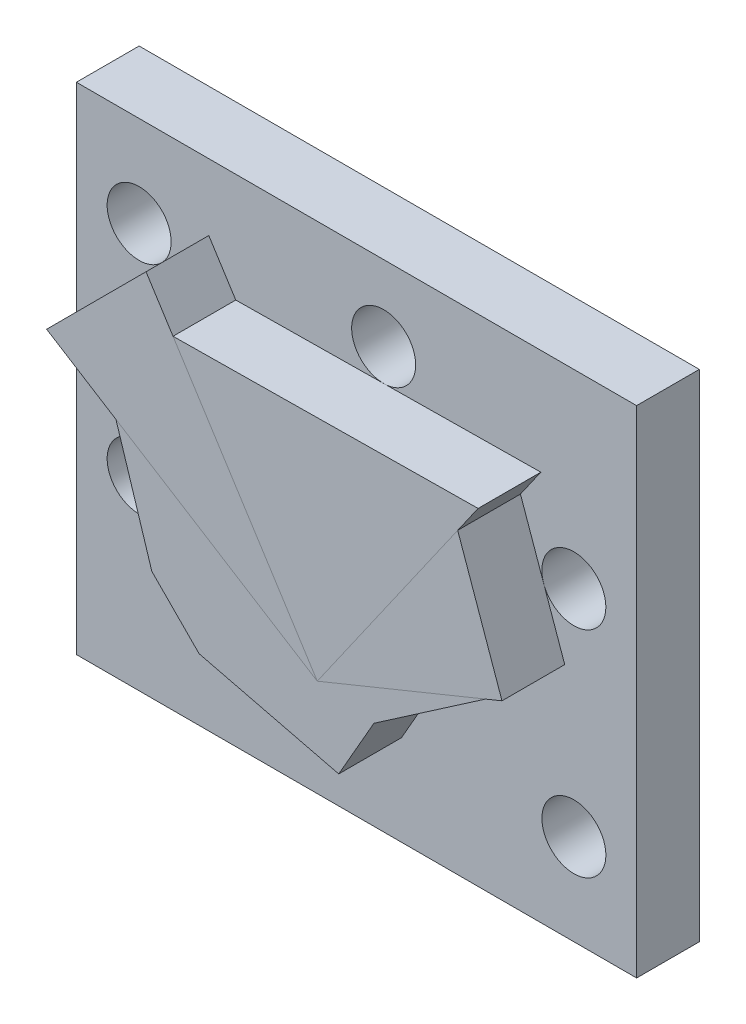
ISO-10303-21;
HEADER;
FILE_DESCRIPTION(('STEP AP214'),'2;1');
FILE_NAME('part.step','',(''),(''),'','','');
FILE_SCHEMA(('AUTOMOTIVE_DESIGN { 1 0 10303 214 1 1 1 1 }'));
ENDSEC;
DATA;
#1=APPLICATION_CONTEXT('core data for automotive mechanical design processes');
#2=APPLICATION_PROTOCOL_DEFINITION('international standard','automotive_design',2000,#1);
#3=PRODUCT_CONTEXT('',#1,'mechanical');
#4=PRODUCT('Part','Part','',(#3));
#5=PRODUCT_RELATED_PRODUCT_CATEGORY('part','',(#4));
#6=PRODUCT_DEFINITION_FORMATION('','',#4);
#7=PRODUCT_DEFINITION_CONTEXT('part definition',#1,'design');
#8=PRODUCT_DEFINITION('design','',#6,#7);
#9=PRODUCT_DEFINITION_SHAPE('','',#8);
#10=(LENGTH_UNIT() NAMED_UNIT(*) SI_UNIT(.MILLI.,.METRE.));
#11=(NAMED_UNIT(*) PLANE_ANGLE_UNIT() SI_UNIT($,.RADIAN.));
#12=(NAMED_UNIT(*) SI_UNIT($,.STERADIAN.) SOLID_ANGLE_UNIT());
#13=UNCERTAINTY_MEASURE_WITH_UNIT(LENGTH_MEASURE(1.E-05),#10,'distance_accuracy_value','');
#14=(GEOMETRIC_REPRESENTATION_CONTEXT(3) GLOBAL_UNCERTAINTY_ASSIGNED_CONTEXT((#13)) GLOBAL_UNIT_ASSIGNED_CONTEXT((#10,
#11,#12)) REPRESENTATION_CONTEXT('',''));
#15=CARTESIAN_POINT('',(0.,0.,0.));
#16=DIRECTION('',(0.,0.,1.));
#17=DIRECTION('',(1.,0.,0.));
#18=AXIS2_PLACEMENT_3D('',#15,#16,#17);
#19=CARTESIAN_POINT('',(14.4198396881023,-35.3574469152268,10.));
#20=DIRECTION('',(0.377632733495836,-0.925955462531791,0.));
#21=DIRECTION('',(0.925955462531791,0.377632733495836,0.));
#22=AXIS2_PLACEMENT_3D('',#19,#20,#21);
#23=PLANE('',#22);
#24=DIRECTION('',(-0.925955462531791,-0.377632733495836,0.));
#25=VECTOR('',#24,1.);
#26=CARTESIAN_POINT('',(14.4198396881023,-35.3574469152268,0.));
#27=LINE('',#26,#25);
#28=CARTESIAN_POINT('',(28.8574048943061,-29.4693697511959,0.));
#29=VERTEX_POINT('',#28);
#30=CARTESIAN_POINT('',(-0.582015344167753,-41.4756585923353,0.));
#31=VERTEX_POINT('',#30);
#32=EDGE_CURVE('E88',#29,#31,#27,.T.);
#33=ORIENTED_EDGE('',*,*,#32,.F.);
#34=DIRECTION('',(0.,0.,-1.));
#35=VECTOR('',#34,1.);
#36=CARTESIAN_POINT('',(28.8574048943061,-29.4693697511959,10.));
#37=LINE('',#36,#35);
#38=CARTESIAN_POINT('',(28.8574048943061,-29.4693697511959,10.));
#39=VERTEX_POINT('',#38);
#40=EDGE_CURVE('E12',#39,#29,#37,.T.);
#41=ORIENTED_EDGE('',*,*,#40,.F.);
#42=DIRECTION('',(-0.925955462531791,-0.377632733495836,0.));
#43=VECTOR('',#42,1.);
#44=CARTESIAN_POINT('',(14.4198396881023,-35.3574469152268,10.));
#45=LINE('',#44,#43);
#46=CARTESIAN_POINT('',(-0.582015344167753,-41.4756585923353,10.));
#47=VERTEX_POINT('',#46);
#48=EDGE_CURVE('E86',#39,#47,#45,.T.);
#49=ORIENTED_EDGE('',*,*,#48,.T.);
#50=DIRECTION('',(0.,0.,-1.));
#51=VECTOR('',#50,1.);
#52=CARTESIAN_POINT('',(-0.582015344167753,-41.4756585923353,10.));
#53=LINE('',#52,#51);
#54=EDGE_CURVE('E70',#47,#31,#53,.T.);
#55=ORIENTED_EDGE('',*,*,#54,.T.);
#56=EDGE_LOOP('',(#33,#41,#49,#55));
#57=FACE_BOUND('',#56,.T.);
#58=ADVANCED_FACE('F54',(#57),#23,.T.);
#59=CARTESIAN_POINT('',(16.4144567462538,5.79225285401134,10.));
#60=DIRECTION('',(0.943009891766731,0.332764697692074,0.));
#61=DIRECTION('',(-0.332764697692074,0.943009891766731,0.));
#62=AXIS2_PLACEMENT_3D('',#59,#60,#61);
#63=PLANE('',#62);
#64=DIRECTION('',(0.332764697692074,-0.943009891766731,0.));
#65=VECTOR('',#64,1.);
#66=CARTESIAN_POINT('',(16.4144567462538,5.79225285401134,0.));
#67=LINE('',#66,#65);
#68=CARTESIAN_POINT('',(21.7988449076238,-9.46637082962865,0.));
#69=VERTEX_POINT('',#68);
#70=EDGE_CURVE('E104',#69,#29,#67,.T.);
#71=ORIENTED_EDGE('',*,*,#70,.F.);
#72=DIRECTION('',(0.,0.,-1.));
#73=VECTOR('',#72,1.);
#74=CARTESIAN_POINT('',(21.7988449076238,-9.46637082962865,10.));
#75=LINE('',#74,#73);
#76=CARTESIAN_POINT('',(21.7988449076238,-9.46637082962865,10.));
#77=VERTEX_POINT('',#76);
#78=EDGE_CURVE('E62',#77,#69,#75,.T.);
#79=ORIENTED_EDGE('',*,*,#78,.F.);
#80=DIRECTION('',(0.332764697692074,-0.943009891766731,0.));
#81=VECTOR('',#80,1.);
#82=CARTESIAN_POINT('',(16.4144567462538,5.79225285401134,10.));
#83=LINE('',#82,#81);
#84=EDGE_CURVE('E95',#77,#39,#83,.T.);
#85=ORIENTED_EDGE('',*,*,#84,.T.);
#86=ORIENTED_EDGE('',*,*,#40,.T.);
#87=EDGE_LOOP('',(#71,#79,#85,#86));
#88=FACE_BOUND('',#87,.T.);
#89=ADVANCED_FACE('F99',(#88),#63,.T.);
#90=CARTESIAN_POINT('',(19.0866539535313,-13.345368318566,10.));
#91=DIRECTION('',(-0.819540223133238,0.573021659858267,0.));
#92=DIRECTION('',(-0.573021659858267,-0.819540223133238,0.));
#93=AXIS2_PLACEMENT_3D('',#90,#91,#92);
#94=PLANE('',#93);
#95=DIRECTION('',(0.573021659858267,0.819540223133238,0.));
#96=VECTOR('',#95,1.);
#97=CARTESIAN_POINT('',(19.0866539535313,-13.345368318566,0.));
#98=LINE('',#97,#96);
#99=EDGE_CURVE('E97',#31,#69,#98,.T.);
#100=ORIENTED_EDGE('',*,*,#99,.F.);
#101=ORIENTED_EDGE('',*,*,#54,.F.);
#102=DIRECTION('',(0.573021659858267,0.819540223133238,0.));
#103=VECTOR('',#102,1.);
#104=CARTESIAN_POINT('',(19.0866539535313,-13.345368318566,10.));
#105=LINE('',#104,#103);
#106=EDGE_CURVE('E96',#47,#77,#105,.T.);
#107=ORIENTED_EDGE('',*,*,#106,.T.);
#108=ORIENTED_EDGE('',*,*,#78,.T.);
#109=EDGE_LOOP('',(#100,#101,#107,#108));
#110=FACE_BOUND('',#109,.T.);
#111=ADVANCED_FACE('F110',(#110),#94,.T.);
#112=CARTESIAN_POINT('',(0.,0.,10.));
#113=DIRECTION('',(0.,0.,1.));
#114=DIRECTION('',(1.,0.,0.));
#115=AXIS2_PLACEMENT_3D('',#112,#113,#114);
#116=PLANE('',#115);
#117=ORIENTED_EDGE('',*,*,#48,.F.);
#118=ORIENTED_EDGE('',*,*,#84,.F.);
#119=ORIENTED_EDGE('',*,*,#106,.F.);
#120=EDGE_LOOP('',(#117,#118,#119));
#121=FACE_BOUND('',#120,.T.);
#122=ADVANCED_FACE('F94',(#121),#116,.T.);
#123=CARTESIAN_POINT('',(0.,0.,0.));
#124=DIRECTION('',(0.,0.,1.));
#125=DIRECTION('',(1.,0.,0.));
#126=AXIS2_PLACEMENT_3D('',#123,#124,#125);
#127=PLANE('',#126);
#128=ORIENTED_EDGE('',*,*,#32,.T.);
#129=ORIENTED_EDGE('',*,*,#99,.T.);
#130=ORIENTED_EDGE('',*,*,#70,.T.);
#131=EDGE_LOOP('',(#128,#129,#130));
#132=FACE_BOUND('',#131,.T.);
#133=ADVANCED_FACE('F109',(#132),#127,.F.);
#134=CLOSED_SHELL('',(#58,#89,#111,#122,#133));
#135=MANIFOLD_SOLID_BREP('B2',#134);
#136=CARTESIAN_POINT('',(19.0866539535313,-13.345368318566,10.));
#137=DIRECTION('',(-0.819540223133238,0.573021659858267,0.));
#138=DIRECTION('',(-0.573021659858267,-0.819540223133238,0.));
#139=AXIS2_PLACEMENT_3D('',#136,#137,#138);
#140=PLANE('',#139);
#141=DIRECTION('',(0.573021659858267,0.819540223133238,0.));
#142=VECTOR('',#141,1.);
#143=CARTESIAN_POINT('',(19.0866539535313,-13.345368318566,0.));
#144=LINE('',#143,#142);
#145=CARTESIAN_POINT('',(-0.582015344167753,-41.4756585923353,0.));
#146=VERTEX_POINT('',#145);
#147=CARTESIAN_POINT('',(25.0502953905899,-4.81611999098536,0.));
#148=VERTEX_POINT('',#147);
#149=EDGE_CURVE('E215',#146,#148,#144,.T.);
#150=ORIENTED_EDGE('',*,*,#149,.T.);
#151=DIRECTION('',(0.,0.,-1.));
#152=VECTOR('',#151,1.);
#153=CARTESIAN_POINT('',(25.0502953905899,-4.81611999098536,10.));
#154=LINE('',#153,#152);
#155=CARTESIAN_POINT('',(25.0502953905899,-4.81611999098536,10.));
#156=VERTEX_POINT('',#155);
#157=EDGE_CURVE('E52',#156,#148,#154,.T.);
#158=ORIENTED_EDGE('',*,*,#157,.F.);
#159=DIRECTION('',(0.573021659858267,0.819540223133238,0.));
#160=VECTOR('',#159,1.);
#161=CARTESIAN_POINT('',(19.0866539535313,-13.345368318566,10.));
#162=LINE('',#161,#160);
#163=CARTESIAN_POINT('',(-0.582015344167753,-41.4756585923353,10.));
#164=VERTEX_POINT('',#163);
#165=EDGE_CURVE('E208',#164,#156,#162,.T.);
#166=ORIENTED_EDGE('',*,*,#165,.F.);
#167=DIRECTION('',(0.,0.,-1.));
#168=VECTOR('',#167,1.);
#169=CARTESIAN_POINT('',(-0.582015344167753,-41.4756585923353,10.));
#170=LINE('',#169,#168);
#171=EDGE_CURVE('E216',#164,#146,#170,.T.);
#172=ORIENTED_EDGE('',*,*,#171,.T.);
#173=EDGE_LOOP('',(#150,#158,#166,#172));
#174=FACE_BOUND('',#173,.T.);
#175=ADVANCED_FACE('F168',(#174),#140,.F.);
#176=CARTESIAN_POINT('',(0.0578583485944003,-5.09967179448814,10.));
#177=DIRECTION('',(0.0113447742341961,-0.999935645978067,0.));
#178=DIRECTION('',(0.999935645978067,0.0113447742341961,0.));
#179=AXIS2_PLACEMENT_3D('',#176,#177,#178);
#180=PLANE('',#179);
#181=DIRECTION('',(-0.999935645978067,-0.0113447742341961,0.));
#182=VECTOR('',#181,1.);
#183=CARTESIAN_POINT('',(0.0578583485944003,-5.09967179448814,0.));
#184=LINE('',#183,#182);
#185=CARTESIAN_POINT('',(-23.5725859667269,-5.36777110356802,0.));
#186=VERTEX_POINT('',#185);
#187=EDGE_CURVE('E196',#148,#186,#184,.T.);
#188=ORIENTED_EDGE('',*,*,#187,.T.);
#189=DIRECTION('',(0.,0.,-1.));
#190=VECTOR('',#189,1.);
#191=CARTESIAN_POINT('',(-23.5725859667269,-5.36777110356802,10.));
#192=LINE('',#191,#190);
#193=CARTESIAN_POINT('',(-23.5725859667269,-5.36777110356802,10.));
#194=VERTEX_POINT('',#193);
#195=EDGE_CURVE('E176',#194,#186,#192,.T.);
#196=ORIENTED_EDGE('',*,*,#195,.F.);
#197=DIRECTION('',(-0.999935645978067,-0.0113447742341961,0.));
#198=VECTOR('',#197,1.);
#199=CARTESIAN_POINT('',(0.0578583485944003,-5.09967179448814,10.));
#200=LINE('',#199,#198);
#201=EDGE_CURVE('E204',#156,#194,#200,.T.);
#202=ORIENTED_EDGE('',*,*,#201,.F.);
#203=ORIENTED_EDGE('',*,*,#157,.T.);
#204=EDGE_LOOP('',(#188,#196,#202,#203));
#205=FACE_BOUND('',#204,.T.);
#206=ADVANCED_FACE('F205',(#205),#180,.F.);
#207=CARTESIAN_POINT('',(-19.2045957316195,-12.2279270583982,10.));
#208=DIRECTION('',(0.843525766080245,0.537088709580397,0.));
#209=DIRECTION('',(-0.537088709580397,0.843525766080245,0.));
#210=AXIS2_PLACEMENT_3D('',#207,#208,#209);
#211=PLANE('',#210);
#212=DIRECTION('',(0.537088709580397,-0.843525766080245,0.));
#213=VECTOR('',#212,1.);
#214=CARTESIAN_POINT('',(-19.2045957316195,-12.2279270583982,0.));
#215=LINE('',#214,#213);
#216=EDGE_CURVE('E201',#186,#146,#215,.T.);
#217=ORIENTED_EDGE('',*,*,#216,.T.);
#218=ORIENTED_EDGE('',*,*,#171,.F.);
#219=DIRECTION('',(0.537088709580397,-0.843525766080245,0.));
#220=VECTOR('',#219,1.);
#221=CARTESIAN_POINT('',(-19.2045957316195,-12.2279270583982,10.));
#222=LINE('',#221,#220);
#223=EDGE_CURVE('E184',#194,#164,#222,.T.);
#224=ORIENTED_EDGE('',*,*,#223,.F.);
#225=ORIENTED_EDGE('',*,*,#195,.T.);
#226=EDGE_LOOP('',(#217,#218,#224,#225));
#227=FACE_BOUND('',#226,.T.);
#228=ADVANCED_FACE('F223',(#227),#211,.F.);
#229=CARTESIAN_POINT('',(0.,0.,10.));
#230=DIRECTION('',(0.,0.,1.));
#231=DIRECTION('',(1.,0.,0.));
#232=AXIS2_PLACEMENT_3D('',#229,#230,#231);
#233=PLANE('',#232);
#234=ORIENTED_EDGE('',*,*,#165,.T.);
#235=ORIENTED_EDGE('',*,*,#201,.T.);
#236=ORIENTED_EDGE('',*,*,#223,.T.);
#237=EDGE_LOOP('',(#234,#235,#236));
#238=FACE_BOUND('',#237,.T.);
#239=ADVANCED_FACE('F211',(#238),#233,.T.);
#240=CARTESIAN_POINT('',(0.,0.,0.));
#241=DIRECTION('',(0.,0.,1.));
#242=DIRECTION('',(1.,0.,0.));
#243=AXIS2_PLACEMENT_3D('',#240,#241,#242);
#244=PLANE('',#243);
#245=ORIENTED_EDGE('',*,*,#149,.F.);
#246=ORIENTED_EDGE('',*,*,#216,.F.);
#247=ORIENTED_EDGE('',*,*,#187,.F.);
#248=EDGE_LOOP('',(#245,#246,#247));
#249=FACE_BOUND('',#248,.T.);
#250=ADVANCED_FACE('F224',(#249),#244,.F.);
#251=CLOSED_SHELL('',(#175,#206,#228,#239,#250));
#252=MANIFOLD_SOLID_BREP('B6',#251);
#253=CARTESIAN_POINT('',(-19.2045957316195,-12.2279270583982,10.));
#254=DIRECTION('',(0.843525766080245,0.537088709580397,0.));
#255=DIRECTION('',(-0.537088709580397,0.843525766080245,0.));
#256=AXIS2_PLACEMENT_3D('',#253,#254,#255);
#257=PLANE('',#256);
#258=DIRECTION('',(0.537088709580397,-0.843525766080245,0.));
#259=VECTOR('',#258,1.);
#260=CARTESIAN_POINT('',(-19.2045957316195,-12.2279270583982,0.));
#261=LINE('',#260,#259);
#262=CARTESIAN_POINT('',(-27.8734365088075,1.38693846971547,0.));
#263=VERTEX_POINT('',#262);
#264=CARTESIAN_POINT('',(-0.582015344167753,-41.4756585923353,0.));
#265=VERTEX_POINT('',#264);
#266=EDGE_CURVE('E316',#263,#265,#261,.T.);
#267=ORIENTED_EDGE('',*,*,#266,.F.);
#268=DIRECTION('',(0.,0.,-1.));
#269=VECTOR('',#268,1.);
#270=CARTESIAN_POINT('',(-27.8734365088075,1.38693846971547,10.));
#271=LINE('',#270,#269);
#272=CARTESIAN_POINT('',(-27.8734365088075,1.38693846971547,10.));
#273=VERTEX_POINT('',#272);
#274=EDGE_CURVE('E166',#273,#263,#271,.T.);
#275=ORIENTED_EDGE('',*,*,#274,.F.);
#276=DIRECTION('',(0.537088709580397,-0.843525766080245,0.));
#277=VECTOR('',#276,1.);
#278=CARTESIAN_POINT('',(-19.2045957316195,-12.2279270583982,10.));
#279=LINE('',#278,#277);
#280=CARTESIAN_POINT('',(-0.582015344167753,-41.4756585923353,10.));
#281=VERTEX_POINT('',#280);
#282=EDGE_CURVE('E314',#273,#281,#279,.T.);
#283=ORIENTED_EDGE('',*,*,#282,.T.);
#284=DIRECTION('',(0.,0.,-1.));
#285=VECTOR('',#284,1.);
#286=CARTESIAN_POINT('',(-0.582015344167753,-41.4756585923353,10.));
#287=LINE('',#286,#285);
#288=EDGE_CURVE('E298',#281,#265,#287,.T.);
#289=ORIENTED_EDGE('',*,*,#288,.T.);
#290=EDGE_LOOP('',(#267,#275,#283,#289));
#291=FACE_BOUND('',#290,.T.);
#292=ADVANCED_FACE('F282',(#291),#257,.T.);
#293=CARTESIAN_POINT('',(-14.63941757688,14.6297251504369,10.));
#294=DIRECTION('',(-0.707340899601853,0.706872585230493,0.));
#295=DIRECTION('',(-0.706872585230493,-0.707340899601853,0.));
#296=AXIS2_PLACEMENT_3D('',#293,#294,#295);
#297=PLANE('',#296);
#298=DIRECTION('',(0.706872585230493,0.707340899601853,0.));
#299=VECTOR('',#298,1.);
#300=CARTESIAN_POINT('',(-14.63941757688,14.6297251504369,0.));
#301=LINE('',#300,#299);
#302=CARTESIAN_POINT('',(-43.7167495872754,-14.4668710565701,0.));
#303=VERTEX_POINT('',#302);
#304=EDGE_CURVE('E332',#303,#263,#301,.T.);
#305=ORIENTED_EDGE('',*,*,#304,.F.);
#306=DIRECTION('',(0.,0.,-1.));
#307=VECTOR('',#306,1.);
#308=CARTESIAN_POINT('',(-43.7167495872754,-14.4668710565701,10.));
#309=LINE('',#308,#307);
#310=CARTESIAN_POINT('',(-43.7167495872754,-14.4668710565701,10.));
#311=VERTEX_POINT('',#310);
#312=EDGE_CURVE('E290',#311,#303,#309,.T.);
#313=ORIENTED_EDGE('',*,*,#312,.F.);
#314=DIRECTION('',(0.706872585230493,0.707340899601853,0.));
#315=VECTOR('',#314,1.);
#316=CARTESIAN_POINT('',(-14.63941757688,14.6297251504369,10.));
#317=LINE('',#316,#315);
#318=EDGE_CURVE('E323',#311,#273,#317,.T.);
#319=ORIENTED_EDGE('',*,*,#318,.T.);
#320=ORIENTED_EDGE('',*,*,#274,.T.);
#321=EDGE_LOOP('',(#305,#313,#319,#320));
#322=FACE_BOUND('',#321,.T.);
#323=ADVANCED_FACE('F327',(#322),#297,.T.);
#324=CARTESIAN_POINT('',(-18.8196539534105,-30.0561723014278,10.));
#325=DIRECTION('',(-0.530699291096881,-0.84756018218724,0.));
#326=DIRECTION('',(0.84756018218724,-0.530699291096881,0.));
#327=AXIS2_PLACEMENT_3D('',#324,#325,#326);
#328=PLANE('',#327);
#329=DIRECTION('',(-0.84756018218724,0.530699291096881,0.));
#330=VECTOR('',#329,1.);
#331=CARTESIAN_POINT('',(-18.8196539534105,-30.0561723014278,0.));
#332=LINE('',#331,#330);
#333=EDGE_CURVE('E325',#265,#303,#332,.T.);
#334=ORIENTED_EDGE('',*,*,#333,.F.);
#335=ORIENTED_EDGE('',*,*,#288,.F.);
#336=DIRECTION('',(-0.84756018218724,0.530699291096881,0.));
#337=VECTOR('',#336,1.);
#338=CARTESIAN_POINT('',(-18.8196539534105,-30.0561723014278,10.));
#339=LINE('',#338,#337);
#340=EDGE_CURVE('E324',#281,#311,#339,.T.);
#341=ORIENTED_EDGE('',*,*,#340,.T.);
#342=ORIENTED_EDGE('',*,*,#312,.T.);
#343=EDGE_LOOP('',(#334,#335,#341,#342));
#344=FACE_BOUND('',#343,.T.);
#345=ADVANCED_FACE('F338',(#344),#328,.T.);
#346=CARTESIAN_POINT('',(0.,0.,10.));
#347=DIRECTION('',(0.,0.,1.));
#348=DIRECTION('',(1.,0.,0.));
#349=AXIS2_PLACEMENT_3D('',#346,#347,#348);
#350=PLANE('',#349);
#351=ORIENTED_EDGE('',*,*,#282,.F.);
#352=ORIENTED_EDGE('',*,*,#318,.F.);
#353=ORIENTED_EDGE('',*,*,#340,.F.);
#354=EDGE_LOOP('',(#351,#352,#353));
#355=FACE_BOUND('',#354,.T.);
#356=ADVANCED_FACE('F322',(#355),#350,.T.);
#357=CARTESIAN_POINT('',(0.,0.,0.));
#358=DIRECTION('',(0.,0.,1.));
#359=DIRECTION('',(1.,0.,0.));
#360=AXIS2_PLACEMENT_3D('',#357,#358,#359);
#361=PLANE('',#360);
#362=ORIENTED_EDGE('',*,*,#266,.T.);
#363=ORIENTED_EDGE('',*,*,#333,.T.);
#364=ORIENTED_EDGE('',*,*,#304,.T.);
#365=EDGE_LOOP('',(#362,#363,#364));
#366=FACE_BOUND('',#365,.T.);
#367=ADVANCED_FACE('F337',(#366),#361,.F.);
#368=CLOSED_SHELL('',(#292,#323,#345,#356,#367));
#369=MANIFOLD_SOLID_BREP('B46',#368);
#370=CARTESIAN_POINT('',(-35.8465879097028,-11.3151186259497,10.));
#371=DIRECTION('',(0.953619757175638,0.301013884603814,0.));
#372=DIRECTION('',(-0.301013884603814,0.953619757175638,0.));
#373=AXIS2_PLACEMENT_3D('',#370,#371,#372);
#374=PLANE('',#373);
#375=DIRECTION('',(0.301013884603814,-0.953619757175638,0.));
#376=VECTOR('',#375,1.);
#377=CARTESIAN_POINT('',(-35.8465879097028,-11.3151186259497,0.));
#378=LINE('',#377,#376);
#379=CARTESIAN_POINT('',(-32.6679717958863,-21.3850565313118,0.));
#380=VERTEX_POINT('',#379);
#381=CARTESIAN_POINT('',(-26.9478256393098,-39.5066272223884,0.));
#382=VERTEX_POINT('',#381);
#383=EDGE_CURVE('E485',#380,#382,#378,.T.);
#384=ORIENTED_EDGE('',*,*,#383,.T.);
#385=DIRECTION('',(0.,0.,-1.));
#386=VECTOR('',#385,1.);
#387=CARTESIAN_POINT('',(-26.9478256393098,-39.5066272223884,10.));
#388=LINE('',#387,#386);
#389=CARTESIAN_POINT('',(-26.9478256393098,-39.5066272223884,10.));
#390=VERTEX_POINT('',#389);
#391=EDGE_CURVE('E280',#390,#382,#388,.T.);
#392=ORIENTED_EDGE('',*,*,#391,.F.);
#393=DIRECTION('',(0.301013884603814,-0.953619757175638,0.));
#394=VECTOR('',#393,1.);
#395=CARTESIAN_POINT('',(-35.8465879097028,-11.3151186259497,10.));
#396=LINE('',#395,#394);
#397=CARTESIAN_POINT('',(-32.6679717958863,-21.3850565313118,10.));
#398=VERTEX_POINT('',#397);
#399=EDGE_CURVE('E497',#398,#390,#396,.T.);
#400=ORIENTED_EDGE('',*,*,#399,.F.);
#401=DIRECTION('',(0.,0.,-1.));
#402=VECTOR('',#401,1.);
#403=CARTESIAN_POINT('',(-32.6679717958863,-21.3850565313118,10.));
#404=LINE('',#403,#402);
#405=EDGE_CURVE('E481',#398,#380,#404,.T.);
#406=ORIENTED_EDGE('',*,*,#405,.T.);
#407=EDGE_LOOP('',(#384,#392,#400,#406));
#408=FACE_BOUND('',#407,.T.);
#409=ADVANCED_FACE('F395',(#408),#374,.F.);
#410=CARTESIAN_POINT('',(-33.3384546587353,-33.0626976246366,10.));
#411=DIRECTION('',(0.71003719880807,0.704164168577746,0.));
#412=DIRECTION('',(-0.704164168577746,0.71003719880807,0.));
#413=AXIS2_PLACEMENT_3D('',#410,#411,#412);
#414=PLANE('',#413);
#415=DIRECTION('',(0.704164168577746,-0.71003719880807,0.));
#416=VECTOR('',#415,1.);
#417=CARTESIAN_POINT('',(-33.3384546587353,-33.0626976246366,0.));
#418=LINE('',#417,#416);
#419=CARTESIAN_POINT('',(-19.4105690280912,-47.106747776288,0.));
#420=VERTEX_POINT('',#419);
#421=EDGE_CURVE('E488',#382,#420,#418,.T.);
#422=ORIENTED_EDGE('',*,*,#421,.T.);
#423=DIRECTION('',(0.,0.,-1.));
#424=VECTOR('',#423,1.);
#425=CARTESIAN_POINT('',(-19.4105690280912,-47.106747776288,10.));
#426=LINE('',#425,#424);
#427=CARTESIAN_POINT('',(-19.4105690280912,-47.106747776288,10.));
#428=VERTEX_POINT('',#427);
#429=EDGE_CURVE('E403',#428,#420,#426,.T.);
#430=ORIENTED_EDGE('',*,*,#429,.F.);
#431=DIRECTION('',(0.704164168577746,-0.71003719880807,0.));
#432=VECTOR('',#431,1.);
#433=CARTESIAN_POINT('',(-33.3384546587353,-33.0626976246366,10.));
#434=LINE('',#433,#432);
#435=EDGE_CURVE('E451',#390,#428,#434,.T.);
#436=ORIENTED_EDGE('',*,*,#435,.F.);
#437=ORIENTED_EDGE('',*,*,#391,.T.);
#438=EDGE_LOOP('',(#422,#430,#436,#437));
#439=FACE_BOUND('',#438,.T.);
#440=ADVANCED_FACE('F522',(#439),#414,.F.);
#441=CARTESIAN_POINT('',(-12.0196150235125,-48.9226041347681,10.));
#442=DIRECTION('',(0.23859094666628,0.97112015743104,0.));
#443=DIRECTION('',(-0.97112015743104,0.23859094666628,0.));
#444=AXIS2_PLACEMENT_3D('',#441,#442,#443);
#445=PLANE('',#444);
#446=DIRECTION('',(0.97112015743104,-0.23859094666628,0.));
#447=VECTOR('',#446,1.);
#448=CARTESIAN_POINT('',(-12.0196150235125,-48.9226041347681,0.));
#449=LINE('',#448,#447);
#450=CARTESIAN_POINT('',(2.83627194843345,-52.5724924715319,0.));
#451=VERTEX_POINT('',#450);
#452=EDGE_CURVE('E490',#420,#451,#449,.T.);
#453=ORIENTED_EDGE('',*,*,#452,.T.);
#454=DIRECTION('',(0.,0.,-1.));
#455=VECTOR('',#454,1.);
#456=CARTESIAN_POINT('',(2.83627194843345,-52.5724924715319,10.));
#457=LINE('',#456,#455);
#458=CARTESIAN_POINT('',(2.83627194843345,-52.5724924715319,10.));
#459=VERTEX_POINT('',#458);
#460=EDGE_CURVE('E501',#459,#451,#457,.T.);
#461=ORIENTED_EDGE('',*,*,#460,.F.);
#462=DIRECTION('',(0.97112015743104,-0.23859094666628,0.));
#463=VECTOR('',#462,1.);
#464=CARTESIAN_POINT('',(-12.0196150235125,-48.9226041347681,10.));
#465=LINE('',#464,#463);
#466=EDGE_CURVE('E509',#428,#459,#465,.T.);
#467=ORIENTED_EDGE('',*,*,#466,.F.);
#468=ORIENTED_EDGE('',*,*,#429,.T.);
#469=EDGE_LOOP('',(#453,#461,#467,#468));
#470=FACE_BOUND('',#469,.T.);
#471=ADVANCED_FACE('F507',(#470),#445,.F.);
#472=CARTESIAN_POINT('',(24.8039971159156,-14.1999172037617,10.));
#473=DIRECTION('',(-0.867847915675809,0.496829946014885,0.));
#474=DIRECTION('',(-0.496829946014885,-0.867847915675809,0.));
#475=AXIS2_PLACEMENT_3D('',#472,#473,#474);
#476=PLANE('',#475);
#477=DIRECTION('',(0.496829946014885,0.867847915675809,0.));
#478=VECTOR('',#477,1.);
#479=CARTESIAN_POINT('',(24.8039971159156,-14.1999172037617,0.));
#480=LINE('',#479,#478);
#481=CARTESIAN_POINT('',(8.44671386436907,-42.7723377871783,0.));
#482=VERTEX_POINT('',#481);
#483=EDGE_CURVE('E492',#451,#482,#480,.T.);
#484=ORIENTED_EDGE('',*,*,#483,.T.);
#485=DIRECTION('',(0.,0.,-1.));
#486=VECTOR('',#485,1.);
#487=CARTESIAN_POINT('',(8.44671386436907,-42.7723377871783,10.));
#488=LINE('',#487,#486);
#489=CARTESIAN_POINT('',(8.44671386436907,-42.7723377871783,10.));
#490=VERTEX_POINT('',#489);
#491=EDGE_CURVE('E476',#490,#482,#488,.T.);
#492=ORIENTED_EDGE('',*,*,#491,.F.);
#493=DIRECTION('',(0.496829946014885,0.867847915675809,0.));
#494=VECTOR('',#493,1.);
#495=CARTESIAN_POINT('',(24.8039971159156,-14.1999172037617,10.));
#496=LINE('',#495,#494);
#497=EDGE_CURVE('E467',#459,#490,#496,.T.);
#498=ORIENTED_EDGE('',*,*,#497,.F.);
#499=ORIENTED_EDGE('',*,*,#460,.T.);
#500=EDGE_LOOP('',(#484,#492,#498,#499));
#501=FACE_BOUND('',#500,.T.);
#502=ADVANCED_FACE('F515',(#501),#476,.F.);
#503=CARTESIAN_POINT('',(22.6821444113986,-32.9826394134915,10.));
#504=DIRECTION('',(-0.566640436072525,0.823965179001843,0.));
#505=DIRECTION('',(-0.823965179001843,-0.566640436072525,0.));
#506=AXIS2_PLACEMENT_3D('',#503,#504,#505);
#507=PLANE('',#506);
#508=DIRECTION('',(0.823965179001843,0.566640436072525,0.));
#509=VECTOR('',#508,1.);
#510=CARTESIAN_POINT('',(22.6821444113986,-32.9826394134915,0.));
#511=LINE('',#510,#509);
#512=CARTESIAN_POINT('',(26.2367021809171,-30.5381718365911,0.));
#513=VERTEX_POINT('',#512);
#514=EDGE_CURVE('E475',#482,#513,#511,.T.);
#515=ORIENTED_EDGE('',*,*,#514,.T.);
#516=DIRECTION('',(0.,0.,-1.));
#517=VECTOR('',#516,1.);
#518=CARTESIAN_POINT('',(26.2367021809171,-30.5381718365911,10.));
#519=LINE('',#518,#517);
#520=CARTESIAN_POINT('',(26.2367021809171,-30.5381718365911,10.));
#521=VERTEX_POINT('',#520);
#522=EDGE_CURVE('E472',#521,#513,#519,.T.);
#523=ORIENTED_EDGE('',*,*,#522,.F.);
#524=DIRECTION('',(0.823965179001843,0.566640436072525,0.));
#525=VECTOR('',#524,1.);
#526=CARTESIAN_POINT('',(22.6821444113986,-32.9826394134915,10.));
#527=LINE('',#526,#525);
#528=EDGE_CURVE('E461',#490,#521,#527,.T.);
#529=ORIENTED_EDGE('',*,*,#528,.F.);
#530=ORIENTED_EDGE('',*,*,#491,.T.);
#531=EDGE_LOOP('',(#515,#523,#529,#530));
#532=FACE_BOUND('',#531,.T.);
#533=ADVANCED_FACE('F473',(#532),#507,.F.);
#534=CARTESIAN_POINT('',(14.4198396881023,-35.3574469152268,10.));
#535=DIRECTION('',(0.377632733495836,-0.925955462531791,0.));
#536=DIRECTION('',(0.925955462531791,0.377632733495836,0.));
#537=AXIS2_PLACEMENT_3D('',#534,#535,#536);
#538=PLANE('',#537);
#539=DIRECTION('',(-0.925955462531791,-0.377632733495836,0.));
#540=VECTOR('',#539,1.);
#541=CARTESIAN_POINT('',(14.4198396881023,-35.3574469152268,0.));
#542=LINE('',#541,#540);
#543=CARTESIAN_POINT('',(-0.582015344167753,-41.4756585923353,0.));
#544=VERTEX_POINT('',#543);
#545=EDGE_CURVE('E437',#513,#544,#542,.T.);
#546=ORIENTED_EDGE('',*,*,#545,.T.);
#547=DIRECTION('',(0.,0.,-1.));
#548=VECTOR('',#547,1.);
#549=CARTESIAN_POINT('',(-0.582015344167753,-41.4756585923353,10.));
#550=LINE('',#549,#548);
#551=CARTESIAN_POINT('',(-0.582015344167753,-41.4756585923353,10.));
#552=VERTEX_POINT('',#551);
#553=EDGE_CURVE('E477',#552,#544,#550,.T.);
#554=ORIENTED_EDGE('',*,*,#553,.F.);
#555=DIRECTION('',(-0.925955462531791,-0.377632733495836,0.));
#556=VECTOR('',#555,1.);
#557=CARTESIAN_POINT('',(14.4198396881023,-35.3574469152268,10.));
#558=LINE('',#557,#556);
#559=EDGE_CURVE('E465',#521,#552,#558,.T.);
#560=ORIENTED_EDGE('',*,*,#559,.F.);
#561=ORIENTED_EDGE('',*,*,#522,.T.);
#562=EDGE_LOOP('',(#546,#554,#560,#561));
#563=FACE_BOUND('',#562,.T.);
#564=ADVANCED_FACE('F479',(#563),#538,.F.);
#565=CARTESIAN_POINT('',(-18.8196539534105,-30.0561723014278,10.));
#566=DIRECTION('',(-0.530699291096881,-0.84756018218724,0.));
#567=DIRECTION('',(0.84756018218724,-0.530699291096881,0.));
#568=AXIS2_PLACEMENT_3D('',#565,#566,#567);
#569=PLANE('',#568);
#570=DIRECTION('',(-0.84756018218724,0.530699291096881,0.));
#571=VECTOR('',#570,1.);
#572=CARTESIAN_POINT('',(-18.8196539534105,-30.0561723014278,0.));
#573=LINE('',#572,#571);
#574=EDGE_CURVE('E443',#544,#380,#573,.T.);
#575=ORIENTED_EDGE('',*,*,#574,.T.);
#576=ORIENTED_EDGE('',*,*,#405,.F.);
#577=DIRECTION('',(-0.84756018218724,0.530699291096881,0.));
#578=VECTOR('',#577,1.);
#579=CARTESIAN_POINT('',(-18.8196539534105,-30.0561723014278,10.));
#580=LINE('',#579,#578);
#581=EDGE_CURVE('E411',#552,#398,#580,.T.);
#582=ORIENTED_EDGE('',*,*,#581,.F.);
#583=ORIENTED_EDGE('',*,*,#553,.T.);
#584=EDGE_LOOP('',(#575,#576,#582,#583));
#585=FACE_BOUND('',#584,.T.);
#586=ADVANCED_FACE('F536',(#585),#569,.F.);
#587=CARTESIAN_POINT('',(0.,0.,10.));
#588=DIRECTION('',(0.,0.,1.));
#589=DIRECTION('',(1.,0.,0.));
#590=AXIS2_PLACEMENT_3D('',#587,#588,#589);
#591=PLANE('',#590);
#592=ORIENTED_EDGE('',*,*,#399,.T.);
#593=ORIENTED_EDGE('',*,*,#435,.T.);
#594=ORIENTED_EDGE('',*,*,#466,.T.);
#595=ORIENTED_EDGE('',*,*,#497,.T.);
#596=ORIENTED_EDGE('',*,*,#528,.T.);
#597=ORIENTED_EDGE('',*,*,#559,.T.);
#598=ORIENTED_EDGE('',*,*,#581,.T.);
#599=EDGE_LOOP('',(#592,#593,#594,#595,#596,#597,#598));
#600=FACE_BOUND('',#599,.T.);
#601=ADVANCED_FACE('F463',(#600),#591,.T.);
#602=CARTESIAN_POINT('',(0.,0.,0.));
#603=DIRECTION('',(0.,0.,1.));
#604=DIRECTION('',(1.,0.,0.));
#605=AXIS2_PLACEMENT_3D('',#602,#603,#604);
#606=PLANE('',#605);
#607=ORIENTED_EDGE('',*,*,#383,.F.);
#608=ORIENTED_EDGE('',*,*,#574,.F.);
#609=ORIENTED_EDGE('',*,*,#545,.F.);
#610=ORIENTED_EDGE('',*,*,#514,.F.);
#611=ORIENTED_EDGE('',*,*,#483,.F.);
#612=ORIENTED_EDGE('',*,*,#452,.F.);
#613=ORIENTED_EDGE('',*,*,#421,.F.);
#614=EDGE_LOOP('',(#607,#608,#609,#610,#611,#612,#613));
#615=FACE_BOUND('',#614,.T.);
#616=ADVANCED_FACE('F513',(#615),#606,.F.);
#617=CLOSED_SHELL('',(#409,#440,#471,#502,#533,#564,#586,#601,#616));
#618=MANIFOLD_SOLID_BREP('B160',#617);
#619=CARTESIAN_POINT('',(-48.9659059520764,-67.0038276346837,-10.));
#620=DIRECTION('',(-0.9999999969451,-7.81652033047611E-05,0.));
#621=DIRECTION('',(7.81652033047611E-05,-0.999999996945101,0.));
#622=AXIS2_PLACEMENT_3D('',#619,#620,#621);
#623=PLANE('',#622);
#624=DIRECTION('',(7.81652033047611E-05,-0.9999999969451,0.));
#625=VECTOR('',#624,1.);
#626=CARTESIAN_POINT('',(-48.9659059520764,-67.0038276346837,0.));
#627=LINE('',#626,#625);
#628=CARTESIAN_POINT('',(-48.9720810031375,11.9961721239792,0.));
#629=VERTEX_POINT('',#628);
#630=CARTESIAN_POINT('',(-48.9659059520764,-67.0038276346837,0.));
#631=VERTEX_POINT('',#630);
#632=EDGE_CURVE('E668',#629,#631,#627,.T.);
#633=ORIENTED_EDGE('',*,*,#632,.F.);
#634=DIRECTION('',(0.,0.,1.));
#635=VECTOR('',#634,1.);
#636=CARTESIAN_POINT('',(-48.9720810031375,11.9961721239792,-10.));
#637=LINE('',#636,#635);
#638=CARTESIAN_POINT('',(-48.9720810031375,11.9961721239792,-10.));
#639=VERTEX_POINT('',#638);
#640=EDGE_CURVE('E393',#639,#629,#637,.T.);
#641=ORIENTED_EDGE('',*,*,#640,.F.);
#642=DIRECTION('',(7.81652033047611E-05,-0.9999999969451,0.));
#643=VECTOR('',#642,1.);
#644=CARTESIAN_POINT('',(-48.9659059520764,-67.0038276346837,-10.));
#645=LINE('',#644,#643);
#646=CARTESIAN_POINT('',(-48.9659059520764,-67.0038276346837,-10.));
#647=VERTEX_POINT('',#646);
#648=EDGE_CURVE('E661',#639,#647,#645,.T.);
#649=ORIENTED_EDGE('',*,*,#648,.T.);
#650=DIRECTION('',(0.,0.,1.));
#651=VECTOR('',#650,1.);
#652=CARTESIAN_POINT('',(-48.9659059520764,-67.0038276346837,-10.));
#653=LINE('',#652,#651);
#654=EDGE_CURVE('E606',#647,#631,#653,.T.);
#655=ORIENTED_EDGE('',*,*,#654,.T.);
#656=EDGE_LOOP('',(#633,#641,#649,#655));
#657=FACE_BOUND('',#656,.T.);
#658=ADVANCED_FACE('F603',(#657),#623,.T.);
#659=CARTESIAN_POINT('',(-48.9720810031375,11.9961721239792,-10.));
#660=DIRECTION('',(-7.81652033049631E-05,0.999999996945101,0.));
#661=DIRECTION('',(-0.999999996945101,-7.81652033049631E-05,0.));
#662=AXIS2_PLACEMENT_3D('',#659,#660,#661);
#663=PLANE('',#662);
#664=DIRECTION('',(-0.9999999969451,-7.81652033049631E-05,0.));
#665=VECTOR('',#664,1.);
#666=CARTESIAN_POINT('',(-48.9720810031375,11.9961721239792,0.));
#667=LINE('',#666,#665);
#668=CARTESIAN_POINT('',(40.3099510268699,12.0031508721857,0.));
#669=VERTEX_POINT('',#668);
#670=EDGE_CURVE('E663',#669,#629,#667,.T.);
#671=ORIENTED_EDGE('',*,*,#670,.F.);
#672=DIRECTION('',(0.,0.,1.));
#673=VECTOR('',#672,1.);
#674=CARTESIAN_POINT('',(40.3099510268699,12.0031508721857,-10.));
#675=LINE('',#674,#673);
#676=CARTESIAN_POINT('',(40.3099510268699,12.0031508721857,-10.));
#677=VERTEX_POINT('',#676);
#678=EDGE_CURVE('E612',#677,#669,#675,.T.);
#679=ORIENTED_EDGE('',*,*,#678,.F.);
#680=DIRECTION('',(-0.9999999969451,-7.81652033049631E-05,0.));
#681=VECTOR('',#680,1.);
#682=CARTESIAN_POINT('',(-48.9720810031375,11.9961721239792,-10.));
#683=LINE('',#682,#681);
#684=EDGE_CURVE('E658',#677,#639,#683,.T.);
#685=ORIENTED_EDGE('',*,*,#684,.T.);
#686=ORIENTED_EDGE('',*,*,#640,.T.);
#687=EDGE_LOOP('',(#671,#679,#685,#686));
#688=FACE_BOUND('',#687,.T.);
#689=ADVANCED_FACE('F679',(#688),#663,.T.);
#690=CARTESIAN_POINT('',(40.316126077931,-66.9968488864773,-10.));
#691=DIRECTION('',(0.999999996945101,7.81652033047611E-05,0.));
#692=DIRECTION('',(-7.81652033047611E-05,0.9999999969451,0.));
#693=AXIS2_PLACEMENT_3D('',#690,#691,#692);
#694=PLANE('',#693);
#695=DIRECTION('',(-7.81652033047611E-05,0.999999996945101,0.));
#696=VECTOR('',#695,1.);
#697=CARTESIAN_POINT('',(40.316126077931,-66.9968488864773,0.));
#698=LINE('',#697,#696);
#699=CARTESIAN_POINT('',(40.316126077931,-66.9968488864773,0.));
#700=VERTEX_POINT('',#699);
#701=EDGE_CURVE('E653',#700,#669,#698,.T.);
#702=ORIENTED_EDGE('',*,*,#701,.F.);
#703=DIRECTION('',(0.,0.,1.));
#704=VECTOR('',#703,1.);
#705=CARTESIAN_POINT('',(40.316126077931,-66.9968488864773,-10.));
#706=LINE('',#705,#704);
#707=CARTESIAN_POINT('',(40.316126077931,-66.9968488864773,-10.));
#708=VERTEX_POINT('',#707);
#709=EDGE_CURVE('E648',#708,#700,#706,.T.);
#710=ORIENTED_EDGE('',*,*,#709,.F.);
#711=DIRECTION('',(-7.81652033047611E-05,0.999999996945101,0.));
#712=VECTOR('',#711,1.);
#713=CARTESIAN_POINT('',(40.316126077931,-66.9968488864773,-10.));
#714=LINE('',#713,#712);
#715=EDGE_CURVE('E651',#708,#677,#714,.T.);
#716=ORIENTED_EDGE('',*,*,#715,.T.);
#717=ORIENTED_EDGE('',*,*,#678,.T.);
#718=EDGE_LOOP('',(#702,#710,#716,#717));
#719=FACE_BOUND('',#718,.T.);
#720=ADVANCED_FACE('F650',(#719),#694,.T.);
#721=CARTESIAN_POINT('',(-48.9659059520764,-67.0038276346837,-10.));
#722=DIRECTION('',(7.81652033051963E-05,-0.999999996945101,0.));
#723=DIRECTION('',(0.999999996945101,7.81652033051963E-05,0.));
#724=AXIS2_PLACEMENT_3D('',#721,#722,#723);
#725=PLANE('',#724);
#726=DIRECTION('',(0.9999999969451,7.81652033051963E-05,0.));
#727=VECTOR('',#726,1.);
#728=CARTESIAN_POINT('',(-48.9659059520764,-67.0038276346837,0.));
#729=LINE('',#728,#727);
#730=EDGE_CURVE('E671',#631,#700,#729,.T.);
#731=ORIENTED_EDGE('',*,*,#730,.F.);
#732=ORIENTED_EDGE('',*,*,#654,.F.);
#733=DIRECTION('',(0.9999999969451,7.81652033051963E-05,0.));
#734=VECTOR('',#733,1.);
#735=CARTESIAN_POINT('',(-48.9659059520764,-67.0038276346837,-10.));
#736=LINE('',#735,#734);
#737=EDGE_CURVE('E657',#647,#708,#736,.T.);
#738=ORIENTED_EDGE('',*,*,#737,.T.);
#739=ORIENTED_EDGE('',*,*,#709,.T.);
#740=EDGE_LOOP('',(#731,#732,#738,#739));
#741=FACE_BOUND('',#740,.T.);
#742=ADVANCED_FACE('F660',(#741),#725,.T.);
#743=CARTESIAN_POINT('',(0.,0.,-10.));
#744=DIRECTION('',(0.,0.,-1.));
#745=DIRECTION('',(-1.,0.,0.));
#746=AXIS2_PLACEMENT_3D('',#743,#744,#745);
#747=PLANE('',#746);
#748=CARTESIAN_POINT('',(-38.9709476382386,-2.50304617969167,-10.));
#749=DIRECTION('',(0.,0.,1.));
#750=DIRECTION('',(1.,0.,0.));
#751=AXIS2_PLACEMENT_3D('',#748,#749,#750);
#752=CIRCLE('',#751,5.1);
#753=CARTESIAN_POINT('',(-33.8709476382386,-2.50304617969167,-10.));
#754=VERTEX_POINT('',#753);
#755=EDGE_CURVE('E728',#754,#754,#752,.T.);
#756=ORIENTED_EDGE('',*,*,#755,.T.);
#757=EDGE_LOOP('',(#756));
#758=FACE_BOUND('',#757,.T.);
#759=CARTESIAN_POINT('',(-38.9682118561229,-37.5030460727702,-10.));
#760=DIRECTION('',(0.,0.,1.));
#761=DIRECTION('',(1.,0.,0.));
#762=AXIS2_PLACEMENT_3D('',#759,#760,#761);
#763=CIRCLE('',#762,5.1);
#764=CARTESIAN_POINT('',(-33.8682118561229,-37.5030460727702,-10.));
#765=VERTEX_POINT('',#764);
#766=EDGE_CURVE('E736',#765,#765,#763,.T.);
#767=ORIENTED_EDGE('',*,*,#766,.T.);
#768=EDGE_LOOP('',(#767));
#769=FACE_BOUND('',#768,.T.);
#770=CARTESIAN_POINT('',(-8.65595492520645,-55.0006767624981,-10.));
#771=DIRECTION('',(0.,0.,1.));
#772=DIRECTION('',(1.,0.,0.));
#773=AXIS2_PLACEMENT_3D('',#770,#771,#772);
#774=CIRCLE('',#773,5.1);
#775=CARTESIAN_POINT('',(-3.55595492520645,-55.0006767624981,-10.));
#776=VERTEX_POINT('',#775);
#777=EDGE_CURVE('E742',#776,#776,#774,.T.);
#778=ORIENTED_EDGE('',*,*,#777,.T.);
#779=EDGE_LOOP('',(#778));
#780=FACE_BOUND('',#779,.T.);
#781=CARTESIAN_POINT('',(30.3149927130321,-52.4976305828064,-10.));
#782=DIRECTION('',(0.,0.,1.));
#783=DIRECTION('',(1.,0.,0.));
#784=AXIS2_PLACEMENT_3D('',#781,#782,#783);
#785=CIRCLE('',#784,5.10000000000021);
#786=CARTESIAN_POINT('',(35.4149927130323,-52.4976305828064,-10.));
#787=VERTEX_POINT('',#786);
#788=EDGE_CURVE('E748',#787,#787,#785,.T.);
#789=ORIENTED_EDGE('',*,*,#788,.T.);
#790=EDGE_LOOP('',(#789));
#791=FACE_BOUND('',#790,.T.);
#792=CARTESIAN_POINT('',(30.3122569309267,-18.2660775622523,-10.));
#793=DIRECTION('',(0.,0.,1.));
#794=DIRECTION('',(1.,0.,0.));
#795=AXIS2_PLACEMENT_3D('',#792,#793,#794);
#796=CIRCLE('',#795,5.1);
#797=CARTESIAN_POINT('',(35.4122569309267,-18.2660775622523,-10.));
#798=VERTEX_POINT('',#797);
#799=EDGE_CURVE('E754',#798,#798,#796,.T.);
#800=ORIENTED_EDGE('',*,*,#799,.T.);
#801=EDGE_LOOP('',(#800));
#802=FACE_BOUND('',#801,.T.);
#803=CARTESIAN_POINT('',(0.,0.,-10.));
#804=DIRECTION('',(0.,0.,1.));
#805=DIRECTION('',(1.,0.,0.));
#806=AXIS2_PLACEMENT_3D('',#803,#804,#805);
#807=CIRCLE('',#806,5.10000000000001);
#808=CARTESIAN_POINT('',(5.1,0.,-10.));
#809=VERTEX_POINT('',#808);
#810=EDGE_CURVE('E672',#809,#809,#807,.T.);
#811=ORIENTED_EDGE('',*,*,#810,.T.);
#812=EDGE_LOOP('',(#811));
#813=FACE_BOUND('',#812,.T.);
#814=ORIENTED_EDGE('',*,*,#648,.F.);
#815=ORIENTED_EDGE('',*,*,#684,.F.);
#816=ORIENTED_EDGE('',*,*,#715,.F.);
#817=ORIENTED_EDGE('',*,*,#737,.F.);
#818=EDGE_LOOP('',(#814,#815,#816,#817));
#819=FACE_BOUND('',#818,.T.);
#820=ADVANCED_FACE('F656',(#758,#769,#780,#791,#802,#813,#819),#747,.T.);
#821=CARTESIAN_POINT('',(0.,0.,0.));
#822=DIRECTION('',(0.,0.,-1.));
#823=DIRECTION('',(-1.,0.,0.));
#824=AXIS2_PLACEMENT_3D('',#821,#822,#823);
#825=PLANE('',#824);
#826=CARTESIAN_POINT('',(-38.9709476382386,-2.50304617969167,0.));
#827=DIRECTION('',(0.,0.,1.));
#828=DIRECTION('',(1.,0.,0.));
#829=AXIS2_PLACEMENT_3D('',#826,#827,#828);
#830=CIRCLE('',#829,5.1);
#831=CARTESIAN_POINT('',(-33.8709476382386,-2.50304617969167,0.));
#832=VERTEX_POINT('',#831);
#833=EDGE_CURVE('E731',#832,#832,#830,.T.);
#834=ORIENTED_EDGE('',*,*,#833,.F.);
#835=EDGE_LOOP('',(#834));
#836=FACE_BOUND('',#835,.T.);
#837=CARTESIAN_POINT('',(-38.9682118561229,-37.5030460727702,0.));
#838=DIRECTION('',(0.,0.,1.));
#839=DIRECTION('',(1.,0.,0.));
#840=AXIS2_PLACEMENT_3D('',#837,#838,#839);
#841=CIRCLE('',#840,5.1);
#842=CARTESIAN_POINT('',(-33.8682118561229,-37.5030460727702,0.));
#843=VERTEX_POINT('',#842);
#844=EDGE_CURVE('E733',#843,#843,#841,.T.);
#845=ORIENTED_EDGE('',*,*,#844,.F.);
#846=EDGE_LOOP('',(#845));
#847=FACE_BOUND('',#846,.T.);
#848=CARTESIAN_POINT('',(-8.65595492520645,-55.0006767624981,0.));
#849=DIRECTION('',(0.,0.,1.));
#850=DIRECTION('',(1.,0.,0.));
#851=AXIS2_PLACEMENT_3D('',#848,#849,#850);
#852=CIRCLE('',#851,5.1);
#853=CARTESIAN_POINT('',(-3.55595492520645,-55.0006767624981,0.));
#854=VERTEX_POINT('',#853);
#855=EDGE_CURVE('E739',#854,#854,#852,.T.);
#856=ORIENTED_EDGE('',*,*,#855,.F.);
#857=EDGE_LOOP('',(#856));
#858=FACE_BOUND('',#857,.T.);
#859=CARTESIAN_POINT('',(30.3149927130321,-52.4976305828064,0.));
#860=DIRECTION('',(0.,0.,1.));
#861=DIRECTION('',(1.,0.,0.));
#862=AXIS2_PLACEMENT_3D('',#859,#860,#861);
#863=CIRCLE('',#862,5.10000000000021);
#864=CARTESIAN_POINT('',(35.4149927130323,-52.4976305828064,0.));
#865=VERTEX_POINT('',#864);
#866=EDGE_CURVE('E745',#865,#865,#863,.T.);
#867=ORIENTED_EDGE('',*,*,#866,.F.);
#868=EDGE_LOOP('',(#867));
#869=FACE_BOUND('',#868,.T.);
#870=CARTESIAN_POINT('',(30.3122569309267,-18.2660775622523,0.));
#871=DIRECTION('',(0.,0.,1.));
#872=DIRECTION('',(1.,0.,0.));
#873=AXIS2_PLACEMENT_3D('',#870,#871,#872);
#874=CIRCLE('',#873,5.1);
#875=CARTESIAN_POINT('',(35.4122569309267,-18.2660775622523,0.));
#876=VERTEX_POINT('',#875);
#877=EDGE_CURVE('E751',#876,#876,#874,.T.);
#878=ORIENTED_EDGE('',*,*,#877,.F.);
#879=EDGE_LOOP('',(#878));
#880=FACE_BOUND('',#879,.T.);
#881=CARTESIAN_POINT('',(0.,0.,0.));
#882=DIRECTION('',(0.,0.,1.));
#883=DIRECTION('',(1.,0.,0.));
#884=AXIS2_PLACEMENT_3D('',#881,#882,#883);
#885=CIRCLE('',#884,5.10000000000001);
#886=CARTESIAN_POINT('',(5.1,0.,0.));
#887=VERTEX_POINT('',#886);
#888=EDGE_CURVE('E757',#887,#887,#885,.T.);
#889=ORIENTED_EDGE('',*,*,#888,.F.);
#890=EDGE_LOOP('',(#889));
#891=FACE_BOUND('',#890,.T.);
#892=ORIENTED_EDGE('',*,*,#632,.T.);
#893=ORIENTED_EDGE('',*,*,#730,.T.);
#894=ORIENTED_EDGE('',*,*,#701,.T.);
#895=ORIENTED_EDGE('',*,*,#670,.T.);
#896=EDGE_LOOP('',(#892,#893,#894,#895));
#897=FACE_BOUND('',#896,.T.);
#898=ADVANCED_FACE('F678',(#836,#847,#858,#869,#880,#891,#897),#825,.F.);
#899=CARTESIAN_POINT('',(0.,0.,-10.));
#900=DIRECTION('',(0.,0.,1.));
#901=DIRECTION('',(1.,0.,0.));
#902=AXIS2_PLACEMENT_3D('',#899,#900,#901);
#903=CYLINDRICAL_SURFACE('',#902,5.10000000000001);
#904=ORIENTED_EDGE('',*,*,#810,.F.);
#905=EDGE_LOOP('',(#904));
#906=FACE_BOUND('',#905,.T.);
#907=ORIENTED_EDGE('',*,*,#888,.T.);
#908=EDGE_LOOP('',(#907));
#909=FACE_BOUND('',#908,.T.);
#910=ADVANCED_FACE('F697',(#906,#909),#903,.F.);
#911=CARTESIAN_POINT('',(30.3122569309267,-18.2660775622523,-10.));
#912=DIRECTION('',(0.,0.,1.));
#913=DIRECTION('',(1.,0.,0.));
#914=AXIS2_PLACEMENT_3D('',#911,#912,#913);
#915=CYLINDRICAL_SURFACE('',#914,5.1);
#916=ORIENTED_EDGE('',*,*,#799,.F.);
#917=EDGE_LOOP('',(#916));
#918=FACE_BOUND('',#917,.T.);
#919=ORIENTED_EDGE('',*,*,#877,.T.);
#920=EDGE_LOOP('',(#919));
#921=FACE_BOUND('',#920,.T.);
#922=ADVANCED_FACE('F704',(#918,#921),#915,.F.);
#923=CARTESIAN_POINT('',(30.3149927130321,-52.4976305828064,-10.));
#924=DIRECTION('',(0.,0.,1.));
#925=DIRECTION('',(1.,0.,0.));
#926=AXIS2_PLACEMENT_3D('',#923,#924,#925);
#927=CYLINDRICAL_SURFACE('',#926,5.10000000000021);
#928=ORIENTED_EDGE('',*,*,#788,.F.);
#929=EDGE_LOOP('',(#928));
#930=FACE_BOUND('',#929,.T.);
#931=ORIENTED_EDGE('',*,*,#866,.T.);
#932=EDGE_LOOP('',(#931));
#933=FACE_BOUND('',#932,.T.);
#934=ADVANCED_FACE('F708',(#930,#933),#927,.F.);
#935=CARTESIAN_POINT('',(-8.65595492520645,-55.0006767624981,-10.));
#936=DIRECTION('',(0.,0.,1.));
#937=DIRECTION('',(1.,0.,0.));
#938=AXIS2_PLACEMENT_3D('',#935,#936,#937);
#939=CYLINDRICAL_SURFACE('',#938,5.1);
#940=ORIENTED_EDGE('',*,*,#777,.F.);
#941=EDGE_LOOP('',(#940));
#942=FACE_BOUND('',#941,.T.);
#943=ORIENTED_EDGE('',*,*,#855,.T.);
#944=EDGE_LOOP('',(#943));
#945=FACE_BOUND('',#944,.T.);
#946=ADVANCED_FACE('F712',(#942,#945),#939,.F.);
#947=CARTESIAN_POINT('',(-38.9682118561229,-37.5030460727702,-10.));
#948=DIRECTION('',(0.,0.,1.));
#949=DIRECTION('',(1.,0.,0.));
#950=AXIS2_PLACEMENT_3D('',#947,#948,#949);
#951=CYLINDRICAL_SURFACE('',#950,5.1);
#952=ORIENTED_EDGE('',*,*,#766,.F.);
#953=EDGE_LOOP('',(#952));
#954=FACE_BOUND('',#953,.T.);
#955=ORIENTED_EDGE('',*,*,#844,.T.);
#956=EDGE_LOOP('',(#955));
#957=FACE_BOUND('',#956,.T.);
#958=ADVANCED_FACE('F716',(#954,#957),#951,.F.);
#959=CARTESIAN_POINT('',(-38.9709476382386,-2.50304617969167,-10.));
#960=DIRECTION('',(0.,0.,1.));
#961=DIRECTION('',(1.,0.,0.));
#962=AXIS2_PLACEMENT_3D('',#959,#960,#961);
#963=CYLINDRICAL_SURFACE('',#962,5.1);
#964=ORIENTED_EDGE('',*,*,#755,.F.);
#965=EDGE_LOOP('',(#964));
#966=FACE_BOUND('',#965,.T.);
#967=ORIENTED_EDGE('',*,*,#833,.T.);
#968=EDGE_LOOP('',(#967));
#969=FACE_BOUND('',#968,.T.);
#970=ADVANCED_FACE('F720',(#966,#969),#963,.F.);
#971=CLOSED_SHELL('',(#658,#689,#720,#742,#820,#898,#910,#922,#934,#946,#958,#970));
#972=MANIFOLD_SOLID_BREP('B274',#971);
#973=ADVANCED_BREP_SHAPE_REPRESENTATION('',(#18,#135,#252,#369,#618,#972),#14);
#974=SHAPE_DEFINITION_REPRESENTATION(#9,#973);
ENDSEC;
END-ISO-10303-21;
